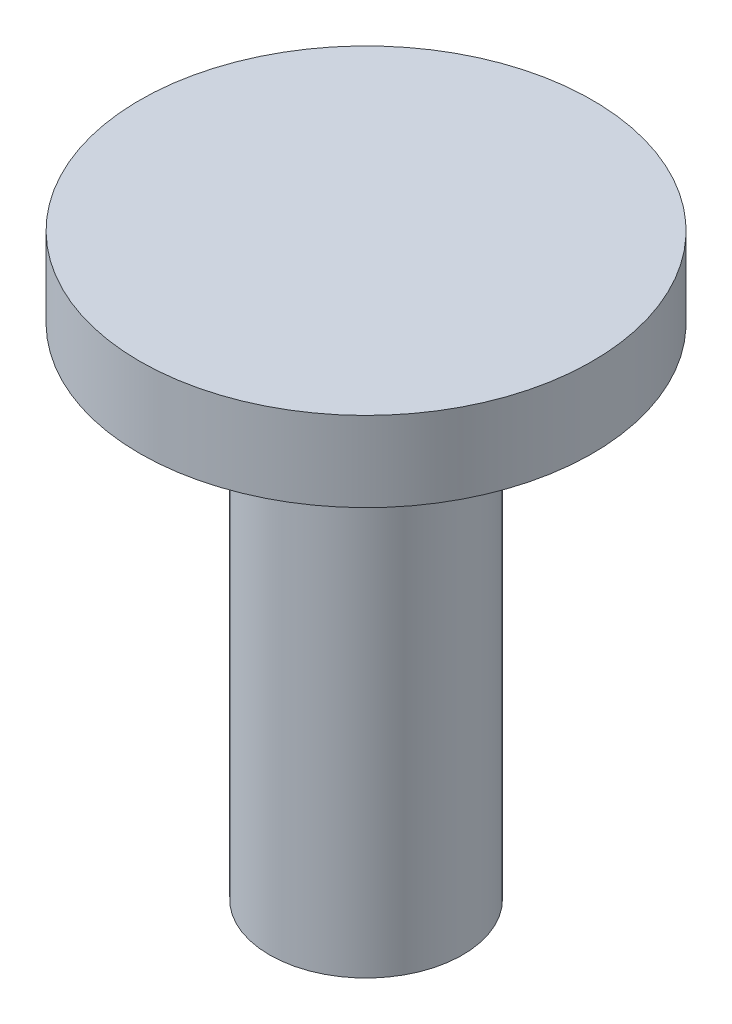
ISO-10303-21;
HEADER;
FILE_DESCRIPTION(('STEP AP214'),'2;1');
FILE_NAME('part.step','',(''),(''),'','','');
FILE_SCHEMA(('AUTOMOTIVE_DESIGN { 1 0 10303 214 1 1 1 1 }'));
ENDSEC;
DATA;
#1=APPLICATION_CONTEXT('core data for automotive mechanical design processes');
#2=APPLICATION_PROTOCOL_DEFINITION('international standard','automotive_design',2000,#1);
#3=PRODUCT_CONTEXT('',#1,'mechanical');
#4=PRODUCT('Part','Part','',(#3));
#5=PRODUCT_RELATED_PRODUCT_CATEGORY('part','',(#4));
#6=PRODUCT_DEFINITION_FORMATION('','',#4);
#7=PRODUCT_DEFINITION_CONTEXT('part definition',#1,'design');
#8=PRODUCT_DEFINITION('design','',#6,#7);
#9=PRODUCT_DEFINITION_SHAPE('','',#8);
#10=(LENGTH_UNIT() NAMED_UNIT(*) SI_UNIT(.MILLI.,.METRE.));
#11=(NAMED_UNIT(*) PLANE_ANGLE_UNIT() SI_UNIT($,.RADIAN.));
#12=(NAMED_UNIT(*) SI_UNIT($,.STERADIAN.) SOLID_ANGLE_UNIT());
#13=UNCERTAINTY_MEASURE_WITH_UNIT(LENGTH_MEASURE(1.E-05),#10,'distance_accuracy_value','');
#14=(GEOMETRIC_REPRESENTATION_CONTEXT(3) GLOBAL_UNCERTAINTY_ASSIGNED_CONTEXT((#13)) GLOBAL_UNIT_ASSIGNED_CONTEXT((#10,
#11,#12)) REPRESENTATION_CONTEXT('',''));
#15=CARTESIAN_POINT('',(0.,0.,0.));
#16=DIRECTION('',(0.,0.,1.));
#17=DIRECTION('',(1.,0.,0.));
#18=AXIS2_PLACEMENT_3D('',#15,#16,#17);
#19=CARTESIAN_POINT('',(0.,7.5,0.));
#20=DIRECTION('',(0.,-1.,0.));
#21=DIRECTION('',(0.,0.,-1.));
#22=AXIS2_PLACEMENT_3D('',#19,#20,#21);
#23=CYLINDRICAL_SURFACE('',#22,1.45);
#24=CARTESIAN_POINT('',(0.,7.5,0.));
#25=DIRECTION('',(0.,1.,0.));
#26=DIRECTION('',(0.,0.,1.));
#27=AXIS2_PLACEMENT_3D('',#24,#25,#26);
#28=CIRCLE('',#27,1.45);
#29=CARTESIAN_POINT('',(0.,7.5,1.45));
#30=VERTEX_POINT('',#29);
#31=EDGE_CURVE('E10',#30,#30,#28,.T.);
#32=ORIENTED_EDGE('',*,*,#31,.F.);
#33=EDGE_LOOP('',(#32));
#34=FACE_BOUND('',#33,.T.);
#35=CARTESIAN_POINT('',(0.,0.,0.));
#36=DIRECTION('',(0.,1.,0.));
#37=DIRECTION('',(0.,0.,1.));
#38=AXIS2_PLACEMENT_3D('',#35,#36,#37);
#39=CIRCLE('',#38,1.45);
#40=CARTESIAN_POINT('',(0.,0.,1.45));
#41=VERTEX_POINT('',#40);
#42=EDGE_CURVE('E33',#41,#41,#39,.T.);
#43=ORIENTED_EDGE('',*,*,#42,.T.);
#44=EDGE_LOOP('',(#43));
#45=FACE_BOUND('',#44,.T.);
#46=ADVANCED_FACE('F30',(#34,#45),#23,.T.);
#47=CARTESIAN_POINT('',(0.,0.,0.));
#48=DIRECTION('',(0.,1.,0.));
#49=DIRECTION('',(0.,0.,1.));
#50=AXIS2_PLACEMENT_3D('',#47,#48,#49);
#51=PLANE('',#50);
#52=ORIENTED_EDGE('',*,*,#42,.F.);
#53=EDGE_LOOP('',(#52));
#54=FACE_BOUND('',#53,.T.);
#55=ADVANCED_FACE('F53',(#54),#51,.F.);
#56=CARTESIAN_POINT('',(0.,8.7,0.));
#57=DIRECTION('',(0.,-1.,0.));
#58=DIRECTION('',(0.,0.,-1.));
#59=AXIS2_PLACEMENT_3D('',#56,#57,#58);
#60=CYLINDRICAL_SURFACE('',#59,3.4);
#61=CARTESIAN_POINT('',(0.,8.7,0.));
#62=DIRECTION('',(0.,1.,0.));
#63=DIRECTION('',(0.,0.,1.));
#64=AXIS2_PLACEMENT_3D('',#61,#62,#63);
#65=CIRCLE('',#64,3.4);
#66=CARTESIAN_POINT('',(0.,8.7,3.4));
#67=VERTEX_POINT('',#66);
#68=EDGE_CURVE('E40',#67,#67,#65,.T.);
#69=ORIENTED_EDGE('',*,*,#68,.F.);
#70=EDGE_LOOP('',(#69));
#71=FACE_BOUND('',#70,.T.);
#72=CARTESIAN_POINT('',(0.,7.5,0.));
#73=DIRECTION('',(0.,1.,0.));
#74=DIRECTION('',(0.,0.,1.));
#75=AXIS2_PLACEMENT_3D('',#72,#73,#74);
#76=CIRCLE('',#75,3.4);
#77=CARTESIAN_POINT('',(0.,7.5,3.4));
#78=VERTEX_POINT('',#77);
#79=EDGE_CURVE('E42',#78,#78,#76,.T.);
#80=ORIENTED_EDGE('',*,*,#79,.T.);
#81=EDGE_LOOP('',(#80));
#82=FACE_BOUND('',#81,.T.);
#83=ADVANCED_FACE('F50',(#71,#82),#60,.T.);
#84=CARTESIAN_POINT('',(0.,8.7,0.));
#85=DIRECTION('',(0.,1.,0.));
#86=DIRECTION('',(0.,0.,1.));
#87=AXIS2_PLACEMENT_3D('',#84,#85,#86);
#88=PLANE('',#87);
#89=ORIENTED_EDGE('',*,*,#68,.T.);
#90=EDGE_LOOP('',(#89));
#91=FACE_BOUND('',#90,.T.);
#92=ADVANCED_FACE('F48',(#91),#88,.T.);
#93=CARTESIAN_POINT('',(0.,7.5,0.));
#94=DIRECTION('',(0.,1.,0.));
#95=DIRECTION('',(0.,0.,1.));
#96=AXIS2_PLACEMENT_3D('',#93,#94,#95);
#97=PLANE('',#96);
#98=ORIENTED_EDGE('',*,*,#31,.T.);
#99=EDGE_LOOP('',(#98));
#100=FACE_BOUND('',#99,.T.);
#101=ORIENTED_EDGE('',*,*,#79,.F.);
#102=EDGE_LOOP('',(#101));
#103=FACE_BOUND('',#102,.T.);
#104=ADVANCED_FACE('F57',(#100,#103),#97,.F.);
#105=CLOSED_SHELL('',(#46,#55,#83,#92,#104));
#106=MANIFOLD_SOLID_BREP('B2',#105);
#107=ADVANCED_BREP_SHAPE_REPRESENTATION('',(#18,#106),#14);
#108=SHAPE_DEFINITION_REPRESENTATION(#9,#107);
ENDSEC;
END-ISO-10303-21;
